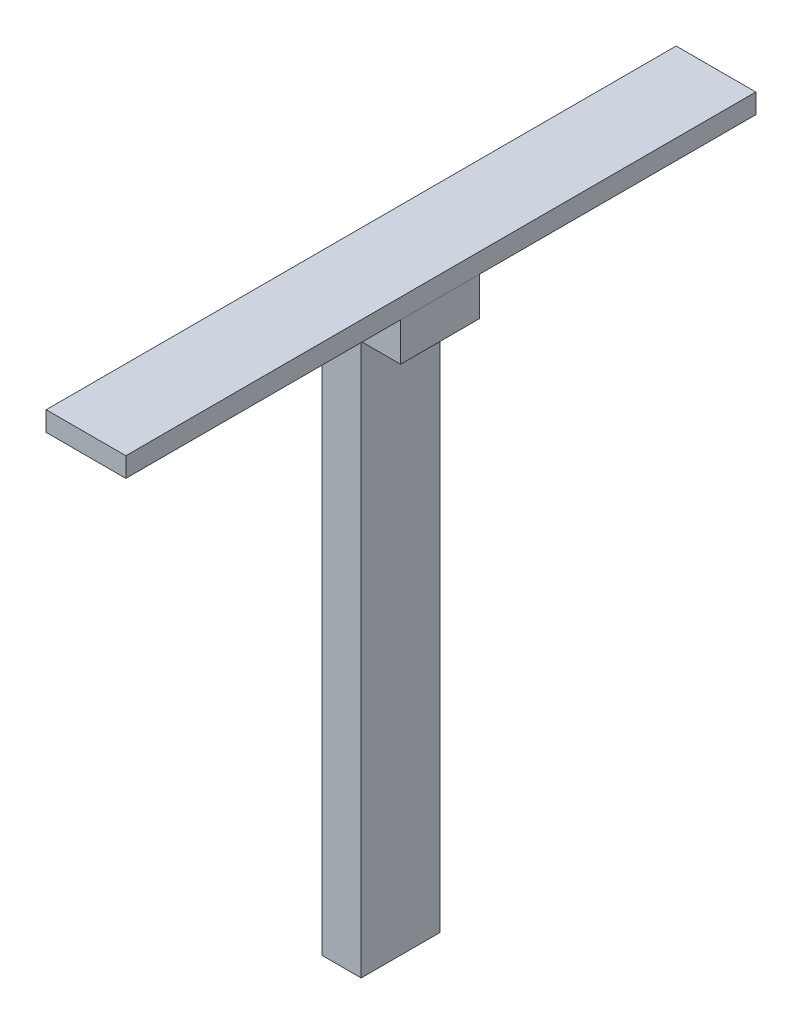
ISO-10303-21;
HEADER;
FILE_DESCRIPTION(('STEP AP214'),'2;1');
FILE_NAME('part.step','',(''),(''),'','','');
FILE_SCHEMA(('AUTOMOTIVE_DESIGN { 1 0 10303 214 1 1 1 1 }'));
ENDSEC;
DATA;
#1=APPLICATION_CONTEXT('core data for automotive mechanical design processes');
#2=APPLICATION_PROTOCOL_DEFINITION('international standard','automotive_design',2000,#1);
#3=PRODUCT_CONTEXT('',#1,'mechanical');
#4=PRODUCT('Part','Part','',(#3));
#5=PRODUCT_RELATED_PRODUCT_CATEGORY('part','',(#4));
#6=PRODUCT_DEFINITION_FORMATION('','',#4);
#7=PRODUCT_DEFINITION_CONTEXT('part definition',#1,'design');
#8=PRODUCT_DEFINITION('design','',#6,#7);
#9=PRODUCT_DEFINITION_SHAPE('','',#8);
#10=(LENGTH_UNIT() NAMED_UNIT(*) SI_UNIT(.MILLI.,.METRE.));
#11=(NAMED_UNIT(*) PLANE_ANGLE_UNIT() SI_UNIT($,.RADIAN.));
#12=(NAMED_UNIT(*) SI_UNIT($,.STERADIAN.) SOLID_ANGLE_UNIT());
#13=UNCERTAINTY_MEASURE_WITH_UNIT(LENGTH_MEASURE(1.E-05),#10,'distance_accuracy_value','');
#14=(GEOMETRIC_REPRESENTATION_CONTEXT(3) GLOBAL_UNCERTAINTY_ASSIGNED_CONTEXT((#13)) GLOBAL_UNIT_ASSIGNED_CONTEXT((#10,
#11,#12)) REPRESENTATION_CONTEXT('',''));
#15=CARTESIAN_POINT('',(0.,0.,0.));
#16=DIRECTION('',(0.,0.,1.));
#17=DIRECTION('',(1.,0.,0.));
#18=AXIS2_PLACEMENT_3D('',#15,#16,#17);
#19=CARTESIAN_POINT('',(0.,150.,-70.));
#20=DIRECTION('',(-1.,0.,0.));
#21=DIRECTION('',(0.,0.,1.));
#22=AXIS2_PLACEMENT_3D('',#19,#20,#21);
#23=PLANE('',#22);
#24=DIRECTION('',(0.,0.,1.));
#25=VECTOR('',#24,1.);
#26=CARTESIAN_POINT('',(0.,150.,-70.));
#27=LINE('',#26,#25);
#28=CARTESIAN_POINT('',(0.,150.,-70.));
#29=VERTEX_POINT('',#28);
#30=CARTESIAN_POINT('',(0.,150.,90.));
#31=VERTEX_POINT('',#30);
#32=EDGE_CURVE('E88',#29,#31,#27,.T.);
#33=ORIENTED_EDGE('',*,*,#32,.T.);
#34=DIRECTION('',(0.,-1.,0.));
#35=VECTOR('',#34,1.);
#36=CARTESIAN_POINT('',(0.,150.,90.));
#37=LINE('',#36,#35);
#38=CARTESIAN_POINT('',(0.,155.,90.));
#39=VERTEX_POINT('',#38);
#40=EDGE_CURVE('E125',#39,#31,#37,.T.);
#41=ORIENTED_EDGE('',*,*,#40,.F.);
#42=DIRECTION('',(0.,0.,1.));
#43=VECTOR('',#42,1.);
#44=CARTESIAN_POINT('',(0.,155.,-70.));
#45=LINE('',#44,#43);
#46=CARTESIAN_POINT('',(0.,155.,-70.));
#47=VERTEX_POINT('',#46);
#48=EDGE_CURVE('E13',#47,#39,#45,.T.);
#49=ORIENTED_EDGE('',*,*,#48,.F.);
#50=DIRECTION('',(0.,-1.,0.));
#51=VECTOR('',#50,1.);
#52=CARTESIAN_POINT('',(0.,150.,-70.));
#53=LINE('',#52,#51);
#54=EDGE_CURVE('E126',#47,#29,#53,.T.);
#55=ORIENTED_EDGE('',*,*,#54,.T.);
#56=EDGE_LOOP('',(#33,#41,#49,#55));
#57=FACE_BOUND('',#56,.T.);
#58=ADVANCED_FACE('F85',(#57),#23,.T.);
#59=CARTESIAN_POINT('',(0.,155.,-70.));
#60=DIRECTION('',(0.,1.,0.));
#61=DIRECTION('',(0.,0.,1.));
#62=AXIS2_PLACEMENT_3D('',#59,#60,#61);
#63=PLANE('',#62);
#64=ORIENTED_EDGE('',*,*,#48,.T.);
#65=DIRECTION('',(-1.,0.,0.));
#66=VECTOR('',#65,1.);
#67=CARTESIAN_POINT('',(0.,155.,90.));
#68=LINE('',#67,#66);
#69=CARTESIAN_POINT('',(20.2324941647625,155.,90.));
#70=VERTEX_POINT('',#69);
#71=EDGE_CURVE('E142',#70,#39,#68,.T.);
#72=ORIENTED_EDGE('',*,*,#71,.F.);
#73=DIRECTION('',(0.,0.,1.));
#74=VECTOR('',#73,1.);
#75=CARTESIAN_POINT('',(20.2324941647625,155.,-70.));
#76=LINE('',#75,#74);
#77=CARTESIAN_POINT('',(20.2324941647625,155.,-70.));
#78=VERTEX_POINT('',#77);
#79=EDGE_CURVE('E93',#78,#70,#76,.T.);
#80=ORIENTED_EDGE('',*,*,#79,.F.);
#81=DIRECTION('',(-1.,0.,0.));
#82=VECTOR('',#81,1.);
#83=CARTESIAN_POINT('',(0.,155.,-70.));
#84=LINE('',#83,#82);
#85=EDGE_CURVE('E131',#78,#47,#84,.T.);
#86=ORIENTED_EDGE('',*,*,#85,.T.);
#87=EDGE_LOOP('',(#64,#72,#80,#86));
#88=FACE_BOUND('',#87,.T.);
#89=ADVANCED_FACE('F157',(#88),#63,.T.);
#90=CARTESIAN_POINT('',(20.2324941647625,150.,-70.));
#91=DIRECTION('',(1.,0.,0.));
#92=DIRECTION('',(0.,0.,-1.));
#93=AXIS2_PLACEMENT_3D('',#90,#91,#92);
#94=PLANE('',#93);
#95=ORIENTED_EDGE('',*,*,#79,.T.);
#96=DIRECTION('',(0.,1.,0.));
#97=VECTOR('',#96,1.);
#98=CARTESIAN_POINT('',(20.2324941647625,150.,90.));
#99=LINE('',#98,#97);
#100=CARTESIAN_POINT('',(20.2324941647625,150.,90.));
#101=VERTEX_POINT('',#100);
#102=EDGE_CURVE('E138',#101,#70,#99,.T.);
#103=ORIENTED_EDGE('',*,*,#102,.F.);
#104=DIRECTION('',(0.,0.,1.));
#105=VECTOR('',#104,1.);
#106=CARTESIAN_POINT('',(20.2324941647625,150.,-70.));
#107=LINE('',#106,#105);
#108=CARTESIAN_POINT('',(20.2324941647625,150.,-70.));
#109=VERTEX_POINT('',#108);
#110=EDGE_CURVE('E130',#109,#101,#107,.T.);
#111=ORIENTED_EDGE('',*,*,#110,.F.);
#112=DIRECTION('',(0.,1.,0.));
#113=VECTOR('',#112,1.);
#114=CARTESIAN_POINT('',(20.2324941647625,150.,-70.));
#115=LINE('',#114,#113);
#116=EDGE_CURVE('E150',#109,#78,#115,.T.);
#117=ORIENTED_EDGE('',*,*,#116,.T.);
#118=EDGE_LOOP('',(#95,#103,#111,#117));
#119=FACE_BOUND('',#118,.T.);
#120=ADVANCED_FACE('F154',(#119),#94,.T.);
#121=CARTESIAN_POINT('',(0.,150.,-70.));
#122=DIRECTION('',(0.,-1.,0.));
#123=DIRECTION('',(0.,0.,-1.));
#124=AXIS2_PLACEMENT_3D('',#121,#122,#123);
#125=PLANE('',#124);
#126=ORIENTED_EDGE('',*,*,#110,.T.);
#127=DIRECTION('',(1.,0.,0.));
#128=VECTOR('',#127,1.);
#129=CARTESIAN_POINT('',(0.,150.,90.));
#130=LINE('',#129,#128);
#131=EDGE_CURVE('E133',#31,#101,#130,.T.);
#132=ORIENTED_EDGE('',*,*,#131,.F.);
#133=ORIENTED_EDGE('',*,*,#32,.F.);
#134=DIRECTION('',(1.,0.,0.));
#135=VECTOR('',#134,1.);
#136=CARTESIAN_POINT('',(0.,150.,-70.));
#137=LINE('',#136,#135);
#138=EDGE_CURVE('E148',#29,#109,#137,.T.);
#139=ORIENTED_EDGE('',*,*,#138,.T.);
#140=EDGE_LOOP('',(#126,#132,#133,#139));
#141=FACE_BOUND('',#140,.T.);
#142=ADVANCED_FACE('F134',(#141),#125,.T.);
#143=CARTESIAN_POINT('',(0.,0.,-70.));
#144=DIRECTION('',(0.,0.,-1.));
#145=DIRECTION('',(-1.,0.,0.));
#146=AXIS2_PLACEMENT_3D('',#143,#144,#145);
#147=PLANE('',#146);
#148=ORIENTED_EDGE('',*,*,#54,.F.);
#149=ORIENTED_EDGE('',*,*,#85,.F.);
#150=ORIENTED_EDGE('',*,*,#116,.F.);
#151=ORIENTED_EDGE('',*,*,#138,.F.);
#152=EDGE_LOOP('',(#148,#149,#150,#151));
#153=FACE_BOUND('',#152,.T.);
#154=ADVANCED_FACE('F159',(#153),#147,.T.);
#155=CARTESIAN_POINT('',(0.,0.,90.));
#156=DIRECTION('',(0.,0.,-1.));
#157=DIRECTION('',(-1.,0.,0.));
#158=AXIS2_PLACEMENT_3D('',#155,#156,#157);
#159=PLANE('',#158);
#160=ORIENTED_EDGE('',*,*,#40,.T.);
#161=ORIENTED_EDGE('',*,*,#131,.T.);
#162=ORIENTED_EDGE('',*,*,#102,.T.);
#163=ORIENTED_EDGE('',*,*,#71,.T.);
#164=EDGE_LOOP('',(#160,#161,#162,#163));
#165=FACE_BOUND('',#164,.T.);
#166=ADVANCED_FACE('F141',(#165),#159,.F.);
#167=CLOSED_SHELL('',(#58,#89,#120,#142,#154,#166));
#168=MANIFOLD_SOLID_BREP('B2',#167);
#169=CARTESIAN_POINT('',(0.,150.,0.));
#170=DIRECTION('',(0.,-1.,0.));
#171=DIRECTION('',(0.,0.,-1.));
#172=AXIS2_PLACEMENT_3D('',#169,#170,#171);
#173=PLANE('',#172);
#174=DIRECTION('',(1.,0.,0.));
#175=VECTOR('',#174,1.);
#176=CARTESIAN_POINT('',(0.,150.,20.));
#177=LINE('',#176,#175);
#178=CARTESIAN_POINT('',(0.,150.,20.));
#179=VERTEX_POINT('',#178);
#180=CARTESIAN_POINT('',(20.,150.,20.));
#181=VERTEX_POINT('',#180);
#182=EDGE_CURVE('E230',#179,#181,#177,.T.);
#183=ORIENTED_EDGE('',*,*,#182,.T.);
#184=DIRECTION('',(0.,0.,1.));
#185=VECTOR('',#184,1.);
#186=CARTESIAN_POINT('',(20.,150.,0.));
#187=LINE('',#186,#185);
#188=CARTESIAN_POINT('',(20.,150.,0.));
#189=VERTEX_POINT('',#188);
#190=EDGE_CURVE('E291',#189,#181,#187,.T.);
#191=ORIENTED_EDGE('',*,*,#190,.F.);
#192=DIRECTION('',(1.,0.,0.));
#193=VECTOR('',#192,1.);
#194=CARTESIAN_POINT('',(0.,150.,0.));
#195=LINE('',#194,#193);
#196=CARTESIAN_POINT('',(0.,150.,0.));
#197=VERTEX_POINT('',#196);
#198=EDGE_CURVE('E261',#197,#189,#195,.T.);
#199=ORIENTED_EDGE('',*,*,#198,.F.);
#200=DIRECTION('',(0.,0.,1.));
#201=VECTOR('',#200,1.);
#202=CARTESIAN_POINT('',(0.,150.,0.));
#203=LINE('',#202,#201);
#204=EDGE_CURVE('E320',#197,#179,#203,.T.);
#205=ORIENTED_EDGE('',*,*,#204,.T.);
#206=EDGE_LOOP('',(#183,#191,#199,#205));
#207=FACE_BOUND('',#206,.T.);
#208=ADVANCED_FACE('F220',(#207),#173,.F.);
#209=CARTESIAN_POINT('',(0.,0.,0.));
#210=DIRECTION('',(0.,-1.,0.));
#211=DIRECTION('',(0.,0.,-1.));
#212=AXIS2_PLACEMENT_3D('',#209,#210,#211);
#213=PLANE('',#212);
#214=DIRECTION('',(0.,0.,-1.));
#215=VECTOR('',#214,1.);
#216=CARTESIAN_POINT('',(10.,0.,20.));
#217=LINE('',#216,#215);
#218=CARTESIAN_POINT('',(10.,0.,20.));
#219=VERTEX_POINT('',#218);
#220=CARTESIAN_POINT('',(10.,0.,0.));
#221=VERTEX_POINT('',#220);
#222=EDGE_CURVE('E344',#219,#221,#217,.T.);
#223=ORIENTED_EDGE('',*,*,#222,.F.);
#224=DIRECTION('',(1.,0.,0.));
#225=VECTOR('',#224,1.);
#226=CARTESIAN_POINT('',(0.,0.,20.));
#227=LINE('',#226,#225);
#228=CARTESIAN_POINT('',(0.,0.,20.));
#229=VERTEX_POINT('',#228);
#230=EDGE_CURVE('E83',#229,#219,#227,.T.);
#231=ORIENTED_EDGE('',*,*,#230,.F.);
#232=DIRECTION('',(0.,0.,1.));
#233=VECTOR('',#232,1.);
#234=CARTESIAN_POINT('',(0.,0.,0.));
#235=LINE('',#234,#233);
#236=CARTESIAN_POINT('',(0.,0.,0.));
#237=VERTEX_POINT('',#236);
#238=EDGE_CURVE('E311',#237,#229,#235,.T.);
#239=ORIENTED_EDGE('',*,*,#238,.F.);
#240=DIRECTION('',(1.,0.,0.));
#241=VECTOR('',#240,1.);
#242=CARTESIAN_POINT('',(0.,0.,0.));
#243=LINE('',#242,#241);
#244=EDGE_CURVE('E295',#237,#221,#243,.T.);
#245=ORIENTED_EDGE('',*,*,#244,.T.);
#246=EDGE_LOOP('',(#223,#231,#239,#245));
#247=FACE_BOUND('',#246,.T.);
#248=ADVANCED_FACE('F355',(#247),#213,.T.);
#249=CARTESIAN_POINT('',(0.,0.,0.));
#250=DIRECTION('',(-1.,0.,0.));
#251=DIRECTION('',(0.,0.,1.));
#252=AXIS2_PLACEMENT_3D('',#249,#250,#251);
#253=PLANE('',#252);
#254=ORIENTED_EDGE('',*,*,#204,.F.);
#255=DIRECTION('',(0.,1.,0.));
#256=VECTOR('',#255,1.);
#257=CARTESIAN_POINT('',(0.,0.,0.));
#258=LINE('',#257,#256);
#259=EDGE_CURVE('E301',#237,#197,#258,.T.);
#260=ORIENTED_EDGE('',*,*,#259,.F.);
#261=ORIENTED_EDGE('',*,*,#238,.T.);
#262=DIRECTION('',(0.,1.,0.));
#263=VECTOR('',#262,1.);
#264=CARTESIAN_POINT('',(0.,0.,20.));
#265=LINE('',#264,#263);
#266=EDGE_CURVE('E304',#229,#179,#265,.T.);
#267=ORIENTED_EDGE('',*,*,#266,.T.);
#268=EDGE_LOOP('',(#254,#260,#261,#267));
#269=FACE_BOUND('',#268,.T.);
#270=ADVANCED_FACE('F354',(#269),#253,.T.);
#271=CARTESIAN_POINT('',(0.,0.,20.));
#272=DIRECTION('',(0.,0.,1.));
#273=DIRECTION('',(1.,0.,0.));
#274=AXIS2_PLACEMENT_3D('',#271,#272,#273);
#275=PLANE('',#274);
#276=DIRECTION('',(0.,-1.,0.));
#277=VECTOR('',#276,1.);
#278=CARTESIAN_POINT('',(10.,140.,20.));
#279=LINE('',#278,#277);
#280=CARTESIAN_POINT('',(10.,140.,20.));
#281=VERTEX_POINT('',#280);
#282=EDGE_CURVE('E339',#281,#219,#279,.T.);
#283=ORIENTED_EDGE('',*,*,#282,.F.);
#284=DIRECTION('',(-1.,0.,0.));
#285=VECTOR('',#284,1.);
#286=CARTESIAN_POINT('',(20.,140.,20.));
#287=LINE('',#286,#285);
#288=CARTESIAN_POINT('',(20.,140.,20.));
#289=VERTEX_POINT('',#288);
#290=EDGE_CURVE('E360',#289,#281,#287,.T.);
#291=ORIENTED_EDGE('',*,*,#290,.F.);
#292=DIRECTION('',(0.,1.,0.));
#293=VECTOR('',#292,1.);
#294=CARTESIAN_POINT('',(20.,0.,20.));
#295=LINE('',#294,#293);
#296=EDGE_CURVE('E284',#289,#181,#295,.T.);
#297=ORIENTED_EDGE('',*,*,#296,.T.);
#298=ORIENTED_EDGE('',*,*,#182,.F.);
#299=ORIENTED_EDGE('',*,*,#266,.F.);
#300=ORIENTED_EDGE('',*,*,#230,.T.);
#301=EDGE_LOOP('',(#283,#291,#297,#298,#299,#300));
#302=FACE_BOUND('',#301,.T.);
#303=ADVANCED_FACE('F358',(#302),#275,.T.);
#304=CARTESIAN_POINT('',(0.,0.,0.));
#305=DIRECTION('',(0.,0.,1.));
#306=DIRECTION('',(1.,0.,0.));
#307=AXIS2_PLACEMENT_3D('',#304,#305,#306);
#308=PLANE('',#307);
#309=DIRECTION('',(1.,0.,0.));
#310=VECTOR('',#309,1.);
#311=CARTESIAN_POINT('',(20.,140.,0.));
#312=LINE('',#311,#310);
#313=CARTESIAN_POINT('',(10.,140.,0.));
#314=VERTEX_POINT('',#313);
#315=CARTESIAN_POINT('',(20.,140.,0.));
#316=VERTEX_POINT('',#315);
#317=EDGE_CURVE('E238',#314,#316,#312,.T.);
#318=ORIENTED_EDGE('',*,*,#317,.F.);
#319=DIRECTION('',(0.,-1.,0.));
#320=VECTOR('',#319,1.);
#321=CARTESIAN_POINT('',(10.,140.,0.));
#322=LINE('',#321,#320);
#323=EDGE_CURVE('E270',#314,#221,#322,.T.);
#324=ORIENTED_EDGE('',*,*,#323,.T.);
#325=ORIENTED_EDGE('',*,*,#244,.F.);
#326=ORIENTED_EDGE('',*,*,#259,.T.);
#327=ORIENTED_EDGE('',*,*,#198,.T.);
#328=DIRECTION('',(0.,1.,0.));
#329=VECTOR('',#328,1.);
#330=CARTESIAN_POINT('',(20.,0.,0.));
#331=LINE('',#330,#329);
#332=EDGE_CURVE('E223',#316,#189,#331,.T.);
#333=ORIENTED_EDGE('',*,*,#332,.F.);
#334=EDGE_LOOP('',(#318,#324,#325,#326,#327,#333));
#335=FACE_BOUND('',#334,.T.);
#336=ADVANCED_FACE('F298',(#335),#308,.F.);
#337=CARTESIAN_POINT('',(20.,0.,0.));
#338=DIRECTION('',(-1.,0.,0.));
#339=DIRECTION('',(0.,0.,1.));
#340=AXIS2_PLACEMENT_3D('',#337,#338,#339);
#341=PLANE('',#340);
#342=ORIENTED_EDGE('',*,*,#296,.F.);
#343=DIRECTION('',(0.,0.,1.));
#344=VECTOR('',#343,1.);
#345=CARTESIAN_POINT('',(20.,140.,20.));
#346=LINE('',#345,#344);
#347=EDGE_CURVE('E292',#316,#289,#346,.T.);
#348=ORIENTED_EDGE('',*,*,#347,.F.);
#349=ORIENTED_EDGE('',*,*,#332,.T.);
#350=ORIENTED_EDGE('',*,*,#190,.T.);
#351=EDGE_LOOP('',(#342,#348,#349,#350));
#352=FACE_BOUND('',#351,.T.);
#353=ADVANCED_FACE('F290',(#352),#341,.F.);
#354=CARTESIAN_POINT('',(10.,140.,20.));
#355=DIRECTION('',(-1.,0.,0.));
#356=DIRECTION('',(0.,0.,1.));
#357=AXIS2_PLACEMENT_3D('',#354,#355,#356);
#358=PLANE('',#357);
#359=ORIENTED_EDGE('',*,*,#222,.T.);
#360=ORIENTED_EDGE('',*,*,#323,.F.);
#361=DIRECTION('',(0.,0.,-1.));
#362=VECTOR('',#361,1.);
#363=CARTESIAN_POINT('',(10.,140.,20.));
#364=LINE('',#363,#362);
#365=EDGE_CURVE('E362',#281,#314,#364,.T.);
#366=ORIENTED_EDGE('',*,*,#365,.F.);
#367=ORIENTED_EDGE('',*,*,#282,.T.);
#368=EDGE_LOOP('',(#359,#360,#366,#367));
#369=FACE_BOUND('',#368,.T.);
#370=ADVANCED_FACE('F361',(#369),#358,.F.);
#371=CARTESIAN_POINT('',(0.,140.,0.));
#372=DIRECTION('',(0.,1.,0.));
#373=DIRECTION('',(0.,0.,1.));
#374=AXIS2_PLACEMENT_3D('',#371,#372,#373);
#375=PLANE('',#374);
#376=ORIENTED_EDGE('',*,*,#347,.T.);
#377=ORIENTED_EDGE('',*,*,#290,.T.);
#378=ORIENTED_EDGE('',*,*,#365,.T.);
#379=ORIENTED_EDGE('',*,*,#317,.T.);
#380=EDGE_LOOP('',(#376,#377,#378,#379));
#381=FACE_BOUND('',#380,.T.);
#382=ADVANCED_FACE('F365',(#381),#375,.F.);
#383=CLOSED_SHELL('',(#208,#248,#270,#303,#336,#353,#370,#382));
#384=MANIFOLD_SOLID_BREP('B7',#383);
#385=ADVANCED_BREP_SHAPE_REPRESENTATION('',(#18,#168,#384),#14);
#386=SHAPE_DEFINITION_REPRESENTATION(#9,#385);
ENDSEC;
END-ISO-10303-21;
